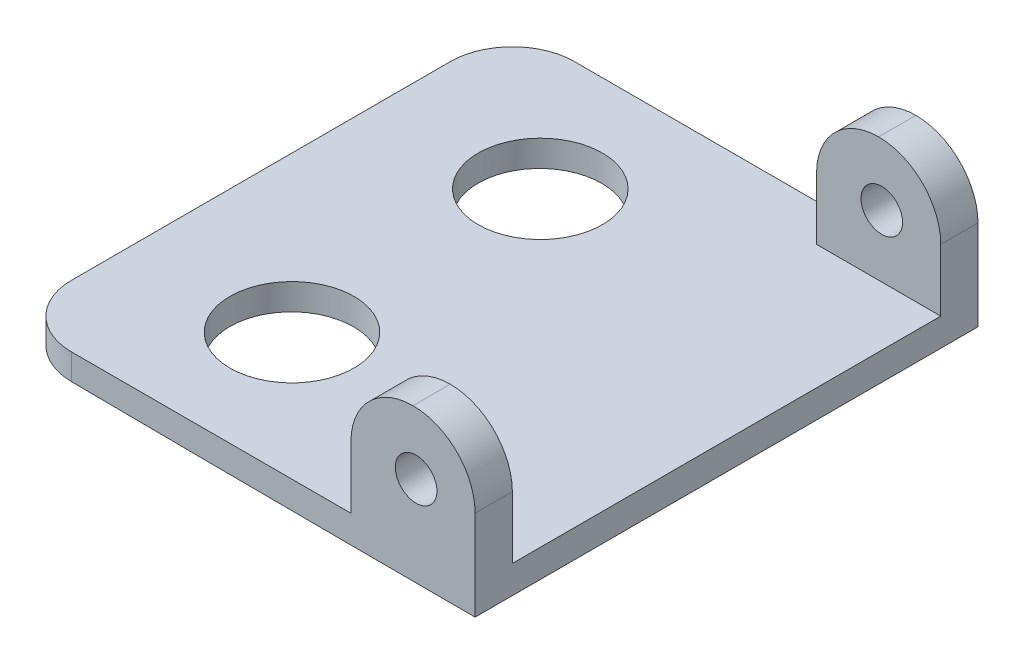
ISO-10303-21;
HEADER;
FILE_DESCRIPTION(('STEP AP214'),'2;1');
FILE_NAME('part.step','',(''),(''),'','','');
FILE_SCHEMA(('AUTOMOTIVE_DESIGN { 1 0 10303 214 1 1 1 1 }'));
ENDSEC;
DATA;
#1=APPLICATION_CONTEXT('core data for automotive mechanical design processes');
#2=APPLICATION_PROTOCOL_DEFINITION('international standard','automotive_design',2000,#1);
#3=PRODUCT_CONTEXT('',#1,'mechanical');
#4=PRODUCT('Part','Part','',(#3));
#5=PRODUCT_RELATED_PRODUCT_CATEGORY('part','',(#4));
#6=PRODUCT_DEFINITION_FORMATION('','',#4);
#7=PRODUCT_DEFINITION_CONTEXT('part definition',#1,'design');
#8=PRODUCT_DEFINITION('design','',#6,#7);
#9=PRODUCT_DEFINITION_SHAPE('','',#8);
#10=(LENGTH_UNIT() NAMED_UNIT(*) SI_UNIT(.MILLI.,.METRE.));
#11=(NAMED_UNIT(*) PLANE_ANGLE_UNIT() SI_UNIT($,.RADIAN.));
#12=(NAMED_UNIT(*) SI_UNIT($,.STERADIAN.) SOLID_ANGLE_UNIT());
#13=UNCERTAINTY_MEASURE_WITH_UNIT(LENGTH_MEASURE(1.E-05),#10,'distance_accuracy_value','');
#14=(GEOMETRIC_REPRESENTATION_CONTEXT(3) GLOBAL_UNCERTAINTY_ASSIGNED_CONTEXT((#13)) GLOBAL_UNIT_ASSIGNED_CONTEXT((#10,
#11,#12)) REPRESENTATION_CONTEXT('',''));
#15=CARTESIAN_POINT('',(0.,0.,0.));
#16=DIRECTION('',(0.,0.,1.));
#17=DIRECTION('',(1.,0.,0.));
#18=AXIS2_PLACEMENT_3D('',#15,#16,#17);
#19=CARTESIAN_POINT('',(-25.8,23.8390216957845,38.07));
#20=DIRECTION('',(0.,0.,1.));
#21=DIRECTION('',(1.,0.,0.));
#22=AXIS2_PLACEMENT_3D('',#19,#20,#21);
#23=PLANE('',#22);
#24=CARTESIAN_POINT('',(-26.75,13.8,38.07));
#25=DIRECTION('',(0.,0.,1.));
#26=DIRECTION('',(1.,0.,0.));
#27=AXIS2_PLACEMENT_3D('',#24,#25,#26);
#28=CIRCLE('',#27,0.334999999999999);
#29=CARTESIAN_POINT('',(-26.415,13.8,38.07));
#30=VERTEX_POINT('',#29);
#31=EDGE_CURVE('E344',#30,#30,#28,.T.);
#32=ORIENTED_EDGE('',*,*,#31,.T.);
#33=EDGE_LOOP('',(#32));
#34=FACE_BOUND('',#33,.T.);
#35=DIRECTION('',(0.,-1.,0.));
#36=VECTOR('',#35,1.);
#37=CARTESIAN_POINT('',(-25.8,23.8390216957845,38.07));
#38=LINE('',#37,#36);
#39=CARTESIAN_POINT('',(-25.8,13.8,38.07));
#40=VERTEX_POINT('',#39);
#41=CARTESIAN_POINT('',(-25.8,12.3504139716503,38.07));
#42=VERTEX_POINT('',#41);
#43=EDGE_CURVE('E188',#40,#42,#38,.T.);
#44=ORIENTED_EDGE('',*,*,#43,.T.);
#45=CARTESIAN_POINT('',(-25.,785.35,38.07));
#46=DIRECTION('',(0.,0.,1.));
#47=DIRECTION('',(1.,0.,0.));
#48=AXIS2_PLACEMENT_3D('',#45,#46,#47);
#49=CIRCLE('',#48,773.);
#50=CARTESIAN_POINT('',(-32.3,12.3844703675331,38.07));
#51=VERTEX_POINT('',#50);
#52=EDGE_CURVE('E165',#42,#51,#49,.F.);
#53=ORIENTED_EDGE('',*,*,#52,.T.);
#54=DIRECTION('',(0.,-1.,0.));
#55=VECTOR('',#54,1.);
#56=CARTESIAN_POINT('',(-32.3,12.8,38.07));
#57=LINE('',#56,#55);
#58=CARTESIAN_POINT('',(-32.3,12.8,38.07));
#59=VERTEX_POINT('',#58);
#60=EDGE_CURVE('E169',#51,#59,#57,.F.);
#61=ORIENTED_EDGE('',*,*,#60,.T.);
#62=DIRECTION('',(-1.,0.,0.));
#63=VECTOR('',#62,1.);
#64=CARTESIAN_POINT('',(-25.8,12.8,38.07));
#65=LINE('',#64,#63);
#66=CARTESIAN_POINT('',(-27.8,12.8,38.07));
#67=VERTEX_POINT('',#66);
#68=EDGE_CURVE('E185',#67,#59,#65,.T.);
#69=ORIENTED_EDGE('',*,*,#68,.F.);
#70=DIRECTION('',(0.,-1.,0.));
#71=VECTOR('',#70,1.);
#72=CARTESIAN_POINT('',(-27.8,14.8,38.07));
#73=LINE('',#72,#71);
#74=CARTESIAN_POINT('',(-27.8,13.8,38.07));
#75=VERTEX_POINT('',#74);
#76=EDGE_CURVE('E292',#75,#67,#73,.T.);
#77=ORIENTED_EDGE('',*,*,#76,.F.);
#78=CARTESIAN_POINT('',(-26.8,13.8,38.07));
#79=DIRECTION('',(0.,0.,1.));
#80=DIRECTION('',(1.,0.,0.));
#81=AXIS2_PLACEMENT_3D('',#78,#79,#80);
#82=CIRCLE('',#81,1.);
#83=CARTESIAN_POINT('',(-26.8,14.8,38.07));
#84=VERTEX_POINT('',#83);
#85=EDGE_CURVE('E288',#75,#84,#82,.F.);
#86=ORIENTED_EDGE('',*,*,#85,.T.);
#87=CARTESIAN_POINT('',(-26.8,13.8,38.07));
#88=DIRECTION('',(0.,0.,1.));
#89=DIRECTION('',(1.,0.,0.));
#90=AXIS2_PLACEMENT_3D('',#87,#88,#89);
#91=CIRCLE('',#90,1.);
#92=EDGE_CURVE('E341',#84,#40,#91,.F.);
#93=ORIENTED_EDGE('',*,*,#92,.T.);
#94=EDGE_LOOP('',(#44,#53,#61,#69,#77,#86,#93));
#95=FACE_BOUND('',#94,.T.);
#96=ADVANCED_FACE('F39',(#34,#95),#23,.F.);
#97=CARTESIAN_POINT('',(-25.8,23.8390216957845,46.17));
#98=DIRECTION('',(0.,0.,1.));
#99=DIRECTION('',(1.,0.,0.));
#100=AXIS2_PLACEMENT_3D('',#97,#98,#99);
#101=PLANE('',#100);
#102=CARTESIAN_POINT('',(-26.75,13.8,46.17));
#103=DIRECTION('',(0.,0.,1.));
#104=DIRECTION('',(1.,0.,0.));
#105=AXIS2_PLACEMENT_3D('',#102,#103,#104);
#106=CIRCLE('',#105,0.334999999999999);
#107=CARTESIAN_POINT('',(-26.415,13.8,46.17));
#108=VERTEX_POINT('',#107);
#109=EDGE_CURVE('E347',#108,#108,#106,.T.);
#110=ORIENTED_EDGE('',*,*,#109,.F.);
#111=EDGE_LOOP('',(#110));
#112=FACE_BOUND('',#111,.T.);
#113=CARTESIAN_POINT('',(-25.,785.35,46.17));
#114=DIRECTION('',(0.,0.,1.));
#115=DIRECTION('',(1.,0.,0.));
#116=AXIS2_PLACEMENT_3D('',#113,#114,#115);
#117=CIRCLE('',#116,773.);
#118=CARTESIAN_POINT('',(-25.8,12.3504139716503,46.17));
#119=VERTEX_POINT('',#118);
#120=CARTESIAN_POINT('',(-32.3,12.3844703675331,46.17));
#121=VERTEX_POINT('',#120);
#122=EDGE_CURVE('E61',#119,#121,#117,.F.);
#123=ORIENTED_EDGE('',*,*,#122,.F.);
#124=DIRECTION('',(0.,-1.,0.));
#125=VECTOR('',#124,1.);
#126=CARTESIAN_POINT('',(-25.8,23.8390216957845,46.17));
#127=LINE('',#126,#125);
#128=CARTESIAN_POINT('',(-25.8,13.8,46.17));
#129=VERTEX_POINT('',#128);
#130=EDGE_CURVE('E317',#129,#119,#127,.T.);
#131=ORIENTED_EDGE('',*,*,#130,.F.);
#132=CARTESIAN_POINT('',(-26.8,13.8,46.17));
#133=DIRECTION('',(0.,0.,1.));
#134=DIRECTION('',(1.,0.,0.));
#135=AXIS2_PLACEMENT_3D('',#132,#133,#134);
#136=CIRCLE('',#135,1.);
#137=CARTESIAN_POINT('',(-26.8,14.8,46.17));
#138=VERTEX_POINT('',#137);
#139=EDGE_CURVE('E336',#129,#138,#136,.T.);
#140=ORIENTED_EDGE('',*,*,#139,.T.);
#141=CARTESIAN_POINT('',(-26.8,13.8,46.17));
#142=DIRECTION('',(0.,0.,1.));
#143=DIRECTION('',(1.,0.,0.));
#144=AXIS2_PLACEMENT_3D('',#141,#142,#143);
#145=CIRCLE('',#144,1.);
#146=CARTESIAN_POINT('',(-27.8,13.8,46.17));
#147=VERTEX_POINT('',#146);
#148=EDGE_CURVE('E334',#138,#147,#145,.T.);
#149=ORIENTED_EDGE('',*,*,#148,.T.);
#150=DIRECTION('',(0.,-1.,0.));
#151=VECTOR('',#150,1.);
#152=CARTESIAN_POINT('',(-27.8,14.8,46.17));
#153=LINE('',#152,#151);
#154=CARTESIAN_POINT('',(-27.8,12.8,46.17));
#155=VERTEX_POINT('',#154);
#156=EDGE_CURVE('E360',#147,#155,#153,.T.);
#157=ORIENTED_EDGE('',*,*,#156,.T.);
#158=DIRECTION('',(-1.,0.,0.));
#159=VECTOR('',#158,1.);
#160=CARTESIAN_POINT('',(-25.8,12.8,46.17));
#161=LINE('',#160,#159);
#162=CARTESIAN_POINT('',(-32.3,12.8,46.17));
#163=VERTEX_POINT('',#162);
#164=EDGE_CURVE('E314',#155,#163,#161,.T.);
#165=ORIENTED_EDGE('',*,*,#164,.T.);
#166=DIRECTION('',(0.,-1.,0.));
#167=VECTOR('',#166,1.);
#168=CARTESIAN_POINT('',(-32.3,23.8390216957845,46.17));
#169=LINE('',#168,#167);
#170=EDGE_CURVE('E11',#163,#121,#169,.T.);
#171=ORIENTED_EDGE('',*,*,#170,.T.);
#172=EDGE_LOOP('',(#123,#131,#140,#149,#157,#165,#171));
#173=FACE_BOUND('',#172,.T.);
#174=ADVANCED_FACE('F251',(#112,#173),#101,.T.);
#175=CARTESIAN_POINT('',(-25.75,12.8,47.));
#176=DIRECTION('',(0.,1.,0.));
#177=DIRECTION('',(0.,0.,1.));
#178=AXIS2_PLACEMENT_3D('',#175,#176,#177);
#179=PLANE('',#178);
#180=CARTESIAN_POINT('',(-30.8,12.8,44.12));
#181=DIRECTION('',(0.,1.,0.));
#182=DIRECTION('',(0.,0.,1.));
#183=AXIS2_PLACEMENT_3D('',#180,#181,#182);
#184=CIRCLE('',#183,0.999999999999995);
#185=CARTESIAN_POINT('',(-30.8,12.8,45.12));
#186=VERTEX_POINT('',#185);
#187=EDGE_CURVE('E195',#186,#186,#184,.T.);
#188=ORIENTED_EDGE('',*,*,#187,.F.);
#189=EDGE_LOOP('',(#188));
#190=FACE_BOUND('',#189,.T.);
#191=CARTESIAN_POINT('',(-30.8,12.8,40.12));
#192=DIRECTION('',(0.,1.,0.));
#193=DIRECTION('',(0.,0.,1.));
#194=AXIS2_PLACEMENT_3D('',#191,#192,#193);
#195=CIRCLE('',#194,0.999999999999992);
#196=CARTESIAN_POINT('',(-30.8,12.8,41.12));
#197=VERTEX_POINT('',#196);
#198=EDGE_CURVE('E192',#197,#197,#195,.T.);
#199=ORIENTED_EDGE('',*,*,#198,.F.);
#200=EDGE_LOOP('',(#199));
#201=FACE_BOUND('',#200,.T.);
#202=ORIENTED_EDGE('',*,*,#68,.T.);
#203=CARTESIAN_POINT('',(-32.3,12.8,39.07));
#204=DIRECTION('',(0.,1.,0.));
#205=DIRECTION('',(0.,0.,1.));
#206=AXIS2_PLACEMENT_3D('',#203,#204,#205);
#207=CIRCLE('',#206,1.);
#208=CARTESIAN_POINT('',(-33.3,12.8,39.07));
#209=VERTEX_POINT('',#208);
#210=EDGE_CURVE('E54',#59,#209,#207,.T.);
#211=ORIENTED_EDGE('',*,*,#210,.T.);
#212=DIRECTION('',(0.,0.,-1.));
#213=VECTOR('',#212,1.);
#214=CARTESIAN_POINT('',(-33.3,12.8,46.17));
#215=LINE('',#214,#213);
#216=CARTESIAN_POINT('',(-33.3,12.8,45.17));
#217=VERTEX_POINT('',#216);
#218=EDGE_CURVE('E182',#217,#209,#215,.T.);
#219=ORIENTED_EDGE('',*,*,#218,.F.);
#220=CARTESIAN_POINT('',(-32.3,12.8,45.17));
#221=DIRECTION('',(0.,1.,0.));
#222=DIRECTION('',(0.,0.,1.));
#223=AXIS2_PLACEMENT_3D('',#220,#221,#222);
#224=CIRCLE('',#223,1.);
#225=EDGE_CURVE('E69',#217,#163,#224,.T.);
#226=ORIENTED_EDGE('',*,*,#225,.T.);
#227=ORIENTED_EDGE('',*,*,#164,.F.);
#228=DIRECTION('',(0.,0.,1.));
#229=VECTOR('',#228,1.);
#230=CARTESIAN_POINT('',(-27.8,12.8,46.17));
#231=LINE('',#230,#229);
#232=CARTESIAN_POINT('',(-27.8,12.8,45.57));
#233=VERTEX_POINT('',#232);
#234=EDGE_CURVE('E357',#233,#155,#231,.T.);
#235=ORIENTED_EDGE('',*,*,#234,.F.);
#236=DIRECTION('',(-1.,0.,0.));
#237=VECTOR('',#236,1.);
#238=CARTESIAN_POINT('',(-25.8,12.8,45.57));
#239=LINE('',#238,#237);
#240=CARTESIAN_POINT('',(-25.8,12.8,45.57));
#241=VERTEX_POINT('',#240);
#242=EDGE_CURVE('E312',#241,#233,#239,.T.);
#243=ORIENTED_EDGE('',*,*,#242,.F.);
#244=DIRECTION('',(0.,0.,-1.));
#245=VECTOR('',#244,1.);
#246=CARTESIAN_POINT('',(-25.8,12.8,46.17));
#247=LINE('',#246,#245);
#248=CARTESIAN_POINT('',(-25.8,12.8,38.67));
#249=VERTEX_POINT('',#248);
#250=EDGE_CURVE('E318',#241,#249,#247,.T.);
#251=ORIENTED_EDGE('',*,*,#250,.T.);
#252=DIRECTION('',(1.,0.,0.));
#253=VECTOR('',#252,1.);
#254=CARTESIAN_POINT('',(-25.8,12.8,38.67));
#255=LINE('',#254,#253);
#256=CARTESIAN_POINT('',(-27.8,12.8,38.67));
#257=VERTEX_POINT('',#256);
#258=EDGE_CURVE('E308',#257,#249,#255,.T.);
#259=ORIENTED_EDGE('',*,*,#258,.F.);
#260=DIRECTION('',(0.,0.,1.));
#261=VECTOR('',#260,1.);
#262=CARTESIAN_POINT('',(-27.8,12.8,38.07));
#263=LINE('',#262,#261);
#264=EDGE_CURVE('E311',#67,#257,#263,.T.);
#265=ORIENTED_EDGE('',*,*,#264,.F.);
#266=EDGE_LOOP('',(#202,#211,#219,#226,#227,#235,#243,#251,#259,#265));
#267=FACE_BOUND('',#266,.T.);
#268=ADVANCED_FACE('F181',(#190,#201,#267),#179,.T.);
#269=CARTESIAN_POINT('',(-33.3,23.8390216957845,46.17));
#270=DIRECTION('',(-1.,0.,0.));
#271=DIRECTION('',(0.,0.,1.));
#272=AXIS2_PLACEMENT_3D('',#269,#270,#271);
#273=PLANE('',#272);
#274=DIRECTION('',(0.,0.,1.));
#275=VECTOR('',#274,1.);
#276=CARTESIAN_POINT('',(-33.3,12.3945614396649,-25.));
#277=LINE('',#276,#275);
#278=CARTESIAN_POINT('',(-33.3,12.3945614396649,45.17));
#279=VERTEX_POINT('',#278);
#280=CARTESIAN_POINT('',(-33.3,12.3945614396649,39.07));
#281=VERTEX_POINT('',#280);
#282=EDGE_CURVE('E150',#279,#281,#277,.F.);
#283=ORIENTED_EDGE('',*,*,#282,.F.);
#284=DIRECTION('',(0.,-1.,0.));
#285=VECTOR('',#284,1.);
#286=CARTESIAN_POINT('',(-33.3,23.8390216957845,45.17));
#287=LINE('',#286,#285);
#288=EDGE_CURVE('E161',#279,#217,#287,.F.);
#289=ORIENTED_EDGE('',*,*,#288,.T.);
#290=ORIENTED_EDGE('',*,*,#218,.T.);
#291=DIRECTION('',(0.,-1.,0.));
#292=VECTOR('',#291,1.);
#293=CARTESIAN_POINT('',(-33.3,12.3501614986573,39.07));
#294=LINE('',#293,#292);
#295=EDGE_CURVE('E163',#209,#281,#294,.T.);
#296=ORIENTED_EDGE('',*,*,#295,.T.);
#297=EDGE_LOOP('',(#283,#289,#290,#296));
#298=FACE_BOUND('',#297,.T.);
#299=ADVANCED_FACE('F159',(#298),#273,.T.);
#300=CARTESIAN_POINT('',(-25.8,23.8390216957845,46.17));
#301=DIRECTION('',(-1.,0.,0.));
#302=DIRECTION('',(0.,0.,1.));
#303=AXIS2_PLACEMENT_3D('',#300,#301,#302);
#304=PLANE('',#303);
#305=ORIENTED_EDGE('',*,*,#130,.T.);
#306=DIRECTION('',(0.,0.,1.));
#307=VECTOR('',#306,1.);
#308=CARTESIAN_POINT('',(-25.8,12.3504139716503,-25.));
#309=LINE('',#308,#307);
#310=EDGE_CURVE('E376',#119,#42,#309,.F.);
#311=ORIENTED_EDGE('',*,*,#310,.T.);
#312=ORIENTED_EDGE('',*,*,#43,.F.);
#313=DIRECTION('',(0.,0.,-1.));
#314=VECTOR('',#313,1.);
#315=CARTESIAN_POINT('',(-25.8,13.8,46.17));
#316=LINE('',#315,#314);
#317=CARTESIAN_POINT('',(-25.8,13.8,38.67));
#318=VERTEX_POINT('',#317);
#319=EDGE_CURVE('E328',#40,#318,#316,.F.);
#320=ORIENTED_EDGE('',*,*,#319,.T.);
#321=DIRECTION('',(0.,-1.,0.));
#322=VECTOR('',#321,1.);
#323=CARTESIAN_POINT('',(-25.8,14.8,38.67));
#324=LINE('',#323,#322);
#325=EDGE_CURVE('E298',#318,#249,#324,.T.);
#326=ORIENTED_EDGE('',*,*,#325,.T.);
#327=ORIENTED_EDGE('',*,*,#250,.F.);
#328=DIRECTION('',(0.,-1.,0.));
#329=VECTOR('',#328,1.);
#330=CARTESIAN_POINT('',(-25.8,14.8,45.57));
#331=LINE('',#330,#329);
#332=CARTESIAN_POINT('',(-25.8,13.8,45.57));
#333=VERTEX_POINT('',#332);
#334=EDGE_CURVE('E304',#333,#241,#331,.T.);
#335=ORIENTED_EDGE('',*,*,#334,.F.);
#336=DIRECTION('',(0.,0.,-1.));
#337=VECTOR('',#336,1.);
#338=CARTESIAN_POINT('',(-25.8,13.8,46.17));
#339=LINE('',#338,#337);
#340=EDGE_CURVE('E331',#333,#129,#339,.F.);
#341=ORIENTED_EDGE('',*,*,#340,.T.);
#342=EDGE_LOOP('',(#305,#311,#312,#320,#326,#327,#335,#341));
#343=FACE_BOUND('',#342,.T.);
#344=ADVANCED_FACE('F246',(#343),#304,.F.);
#345=CARTESIAN_POINT('',(-27.8,14.8,38.07));
#346=DIRECTION('',(1.,0.,0.));
#347=DIRECTION('',(0.,0.,-1.));
#348=AXIS2_PLACEMENT_3D('',#345,#346,#347);
#349=PLANE('',#348);
#350=DIRECTION('',(0.,-1.,0.));
#351=VECTOR('',#350,1.);
#352=CARTESIAN_POINT('',(-27.8,14.8,38.67));
#353=LINE('',#352,#351);
#354=CARTESIAN_POINT('',(-27.8,13.8,38.67));
#355=VERTEX_POINT('',#354);
#356=EDGE_CURVE('E293',#355,#257,#353,.T.);
#357=ORIENTED_EDGE('',*,*,#356,.F.);
#358=DIRECTION('',(0.,0.,1.));
#359=VECTOR('',#358,1.);
#360=CARTESIAN_POINT('',(-27.8,13.8,38.07));
#361=LINE('',#360,#359);
#362=EDGE_CURVE('E167',#355,#75,#361,.F.);
#363=ORIENTED_EDGE('',*,*,#362,.T.);
#364=ORIENTED_EDGE('',*,*,#76,.T.);
#365=ORIENTED_EDGE('',*,*,#264,.T.);
#366=EDGE_LOOP('',(#357,#363,#364,#365));
#367=FACE_BOUND('',#366,.T.);
#368=ADVANCED_FACE('F243',(#367),#349,.F.);
#369=CARTESIAN_POINT('',(-25.8,14.8,38.67));
#370=DIRECTION('',(0.,0.,-1.));
#371=DIRECTION('',(-1.,0.,0.));
#372=AXIS2_PLACEMENT_3D('',#369,#370,#371);
#373=PLANE('',#372);
#374=CARTESIAN_POINT('',(-26.75,13.8,38.67));
#375=DIRECTION('',(0.,0.,-1.));
#376=DIRECTION('',(-1.,0.,0.));
#377=AXIS2_PLACEMENT_3D('',#374,#375,#376);
#378=CIRCLE('',#377,0.334999999999999);
#379=CARTESIAN_POINT('',(-27.085,13.8,38.67));
#380=VERTEX_POINT('',#379);
#381=EDGE_CURVE('E351',#380,#380,#378,.T.);
#382=ORIENTED_EDGE('',*,*,#381,.T.);
#383=EDGE_LOOP('',(#382));
#384=FACE_BOUND('',#383,.T.);
#385=ORIENTED_EDGE('',*,*,#325,.F.);
#386=CARTESIAN_POINT('',(-26.8,13.8,38.67));
#387=DIRECTION('',(0.,0.,-1.));
#388=DIRECTION('',(-1.,0.,0.));
#389=AXIS2_PLACEMENT_3D('',#386,#387,#388);
#390=CIRCLE('',#389,1.);
#391=CARTESIAN_POINT('',(-26.8,14.8,38.67));
#392=VERTEX_POINT('',#391);
#393=EDGE_CURVE('E171',#318,#392,#390,.F.);
#394=ORIENTED_EDGE('',*,*,#393,.T.);
#395=CARTESIAN_POINT('',(-26.8,13.8,38.67));
#396=DIRECTION('',(0.,0.,-1.));
#397=DIRECTION('',(-1.,0.,0.));
#398=AXIS2_PLACEMENT_3D('',#395,#396,#397);
#399=CIRCLE('',#398,1.);
#400=EDGE_CURVE('E286',#392,#355,#399,.F.);
#401=ORIENTED_EDGE('',*,*,#400,.T.);
#402=ORIENTED_EDGE('',*,*,#356,.T.);
#403=ORIENTED_EDGE('',*,*,#258,.T.);
#404=EDGE_LOOP('',(#385,#394,#401,#402,#403));
#405=FACE_BOUND('',#404,.T.);
#406=ADVANCED_FACE('F241',(#384,#405),#373,.F.);
#407=CARTESIAN_POINT('',(-25.8,14.8,45.57));
#408=DIRECTION('',(0.,0.,1.));
#409=DIRECTION('',(1.,0.,0.));
#410=AXIS2_PLACEMENT_3D('',#407,#408,#409);
#411=PLANE('',#410);
#412=CARTESIAN_POINT('',(-26.75,13.8,45.57));
#413=DIRECTION('',(0.,0.,1.));
#414=DIRECTION('',(1.,0.,0.));
#415=AXIS2_PLACEMENT_3D('',#412,#413,#414);
#416=CIRCLE('',#415,0.334999999999999);
#417=CARTESIAN_POINT('',(-26.415,13.8,45.57));
#418=VERTEX_POINT('',#417);
#419=EDGE_CURVE('E174',#418,#418,#416,.T.);
#420=ORIENTED_EDGE('',*,*,#419,.T.);
#421=EDGE_LOOP('',(#420));
#422=FACE_BOUND('',#421,.T.);
#423=CARTESIAN_POINT('',(-26.8,13.8,45.57));
#424=DIRECTION('',(0.,0.,1.));
#425=DIRECTION('',(1.,0.,0.));
#426=AXIS2_PLACEMENT_3D('',#423,#424,#425);
#427=CIRCLE('',#426,1.);
#428=CARTESIAN_POINT('',(-27.8,13.8,45.57));
#429=VERTEX_POINT('',#428);
#430=CARTESIAN_POINT('',(-26.8,14.8,45.57));
#431=VERTEX_POINT('',#430);
#432=EDGE_CURVE('E316',#429,#431,#427,.F.);
#433=ORIENTED_EDGE('',*,*,#432,.T.);
#434=CARTESIAN_POINT('',(-26.8,13.8,45.57));
#435=DIRECTION('',(0.,0.,1.));
#436=DIRECTION('',(1.,0.,0.));
#437=AXIS2_PLACEMENT_3D('',#434,#435,#436);
#438=CIRCLE('',#437,1.);
#439=EDGE_CURVE('E326',#431,#333,#438,.F.);
#440=ORIENTED_EDGE('',*,*,#439,.T.);
#441=ORIENTED_EDGE('',*,*,#334,.T.);
#442=ORIENTED_EDGE('',*,*,#242,.T.);
#443=DIRECTION('',(0.,-1.,0.));
#444=VECTOR('',#443,1.);
#445=CARTESIAN_POINT('',(-27.8,14.8,45.57));
#446=LINE('',#445,#444);
#447=EDGE_CURVE('E361',#429,#233,#446,.T.);
#448=ORIENTED_EDGE('',*,*,#447,.F.);
#449=EDGE_LOOP('',(#433,#440,#441,#442,#448));
#450=FACE_BOUND('',#449,.T.);
#451=ADVANCED_FACE('F237',(#422,#450),#411,.F.);
#452=CARTESIAN_POINT('',(-27.8,14.8,46.17));
#453=DIRECTION('',(1.,0.,0.));
#454=DIRECTION('',(0.,0.,-1.));
#455=AXIS2_PLACEMENT_3D('',#452,#453,#454);
#456=PLANE('',#455);
#457=ORIENTED_EDGE('',*,*,#156,.F.);
#458=DIRECTION('',(0.,0.,1.));
#459=VECTOR('',#458,1.);
#460=CARTESIAN_POINT('',(-27.8,13.8,45.57));
#461=LINE('',#460,#459);
#462=EDGE_CURVE('E338',#147,#429,#461,.F.);
#463=ORIENTED_EDGE('',*,*,#462,.T.);
#464=ORIENTED_EDGE('',*,*,#447,.T.);
#465=ORIENTED_EDGE('',*,*,#234,.T.);
#466=EDGE_LOOP('',(#457,#463,#464,#465));
#467=FACE_BOUND('',#466,.T.);
#468=ADVANCED_FACE('F233',(#467),#456,.F.);
#469=CARTESIAN_POINT('',(-26.8,13.8,0.));
#470=DIRECTION('',(0.,0.,-1.));
#471=DIRECTION('',(-1.,0.,0.));
#472=AXIS2_PLACEMENT_3D('',#469,#470,#471);
#473=CYLINDRICAL_SURFACE('',#472,1.);
#474=ORIENTED_EDGE('',*,*,#462,.F.);
#475=ORIENTED_EDGE('',*,*,#148,.F.);
#476=DIRECTION('',(0.,0.,1.));
#477=VECTOR('',#476,1.);
#478=CARTESIAN_POINT('',(-26.8,14.8,46.17));
#479=LINE('',#478,#477);
#480=EDGE_CURVE('E296',#431,#138,#479,.T.);
#481=ORIENTED_EDGE('',*,*,#480,.F.);
#482=ORIENTED_EDGE('',*,*,#432,.F.);
#483=EDGE_LOOP('',(#474,#475,#481,#482));
#484=FACE_BOUND('',#483,.T.);
#485=ADVANCED_FACE('F236',(#484),#473,.T.);
#486=CARTESIAN_POINT('',(-26.8,13.8,0.));
#487=DIRECTION('',(0.,0.,1.));
#488=DIRECTION('',(1.,0.,0.));
#489=AXIS2_PLACEMENT_3D('',#486,#487,#488);
#490=CYLINDRICAL_SURFACE('',#489,1.);
#491=ORIENTED_EDGE('',*,*,#139,.F.);
#492=ORIENTED_EDGE('',*,*,#340,.F.);
#493=ORIENTED_EDGE('',*,*,#439,.F.);
#494=ORIENTED_EDGE('',*,*,#480,.T.);
#495=EDGE_LOOP('',(#491,#492,#493,#494));
#496=FACE_BOUND('',#495,.T.);
#497=ADVANCED_FACE('F266',(#496),#490,.T.);
#498=CARTESIAN_POINT('',(-26.8,13.8,0.));
#499=DIRECTION('',(0.,0.,1.));
#500=DIRECTION('',(1.,0.,0.));
#501=AXIS2_PLACEMENT_3D('',#498,#499,#500);
#502=CYLINDRICAL_SURFACE('',#501,1.);
#503=ORIENTED_EDGE('',*,*,#362,.F.);
#504=ORIENTED_EDGE('',*,*,#400,.F.);
#505=DIRECTION('',(0.,0.,1.));
#506=VECTOR('',#505,1.);
#507=CARTESIAN_POINT('',(-26.8,14.8,0.));
#508=LINE('',#507,#506);
#509=EDGE_CURVE('E301',#84,#392,#508,.T.);
#510=ORIENTED_EDGE('',*,*,#509,.F.);
#511=ORIENTED_EDGE('',*,*,#85,.F.);
#512=EDGE_LOOP('',(#503,#504,#510,#511));
#513=FACE_BOUND('',#512,.T.);
#514=ADVANCED_FACE('F269',(#513),#502,.T.);
#515=CARTESIAN_POINT('',(-26.8,13.8,0.));
#516=DIRECTION('',(0.,0.,-1.));
#517=DIRECTION('',(-1.,0.,0.));
#518=AXIS2_PLACEMENT_3D('',#515,#516,#517);
#519=CYLINDRICAL_SURFACE('',#518,1.);
#520=ORIENTED_EDGE('',*,*,#393,.F.);
#521=ORIENTED_EDGE('',*,*,#319,.F.);
#522=ORIENTED_EDGE('',*,*,#92,.F.);
#523=ORIENTED_EDGE('',*,*,#509,.T.);
#524=EDGE_LOOP('',(#520,#521,#522,#523));
#525=FACE_BOUND('',#524,.T.);
#526=ADVANCED_FACE('F274',(#525),#519,.T.);
#527=CARTESIAN_POINT('',(-26.75,13.8,37.27));
#528=DIRECTION('',(0.,0.,1.));
#529=DIRECTION('',(1.,0.,0.));
#530=AXIS2_PLACEMENT_3D('',#527,#528,#529);
#531=CYLINDRICAL_SURFACE('',#530,0.334999999999999);
#532=ORIENTED_EDGE('',*,*,#109,.T.);
#533=EDGE_LOOP('',(#532));
#534=FACE_BOUND('',#533,.T.);
#535=ORIENTED_EDGE('',*,*,#419,.F.);
#536=EDGE_LOOP('',(#535));
#537=FACE_BOUND('',#536,.T.);
#538=ADVANCED_FACE('F231',(#534,#537),#531,.F.);
#539=ORIENTED_EDGE('',*,*,#381,.F.);
#540=EDGE_LOOP('',(#539));
#541=FACE_BOUND('',#540,.T.);
#542=ORIENTED_EDGE('',*,*,#31,.F.);
#543=EDGE_LOOP('',(#542));
#544=FACE_BOUND('',#543,.T.);
#545=ADVANCED_FACE('F228',(#541,#544),#531,.F.);
#546=CARTESIAN_POINT('',(-32.3,23.8390216957845,39.07));
#547=DIRECTION('',(0.,1.,0.));
#548=DIRECTION('',(0.,0.,1.));
#549=AXIS2_PLACEMENT_3D('',#546,#547,#548);
#550=CYLINDRICAL_SURFACE('',#549,1.);
#551=CARTESIAN_POINT('',(-33.3,12.3945614396649,39.07));
#552=CARTESIAN_POINT('',(-33.2999998137601,12.3945614465502,39.0418663857055));
#553=CARTESIAN_POINT('',(-33.2988120047079,12.3945486819936,39.0137462500586));
#554=CARTESIAN_POINT('',(-33.2940733568954,12.3944978166805,38.9577072120704));
#555=CARTESIAN_POINT('',(-33.2905226317855,12.3944597171425,38.929788300116));
#556=CARTESIAN_POINT('',(-33.2763598368352,12.3943078914775,38.8466822855112));
#557=CARTESIAN_POINT('',(-33.2622370536639,12.3941566368247,38.7920518781899));
#558=CARTESIAN_POINT('',(-33.2250213255105,12.3937597338588,38.6859391980101));
#559=CARTESIAN_POINT('',(-33.2019240800075,12.3935140402917,38.6344584481629));
#560=CARTESIAN_POINT('',(-33.1474176281085,12.3929375923448,38.5361068768723));
#561=CARTESIAN_POINT('',(-33.1160098818989,12.3926068529083,38.4892352475714));
#562=CARTESIAN_POINT('',(-33.0457726824167,12.3918725624951,38.4014308411662));
#563=CARTESIAN_POINT('',(-33.0069430987487,12.3914690102393,38.3604981684264));
#564=CARTESIAN_POINT('',(-32.9229544547583,12.3906035550816,38.2857239039598));
#565=CARTESIAN_POINT('',(-32.8777941568232,12.3901416407721,38.2518837019993));
#566=CARTESIAN_POINT('',(-32.7824268359952,12.3891755690483,38.192259155652));
#567=CARTESIAN_POINT('',(-32.7322185614688,12.3886714011624,38.1664768157355));
#568=CARTESIAN_POINT('',(-32.6281962367001,12.3876378374712,38.1237206706646));
#569=CARTESIAN_POINT('',(-32.5743843173477,12.3871084566272,38.106741710972));
#570=CARTESIAN_POINT('',(-32.4835361453191,12.3862246599377,38.0862921914962));
#571=CARTESIAN_POINT('',(-32.4470712611249,12.3858724608665,38.0801863176623));
#572=CARTESIAN_POINT('',(-32.3737426877949,12.3851694450506,38.0720407582208));
#573=CARTESIAN_POINT('',(-32.3368796386332,12.3848186270531,38.069995309781));
#574=CARTESIAN_POINT('',(-32.3,12.3844703675331,38.07));
#575=B_SPLINE_CURVE_WITH_KNOTS('',3,(#551,#552,#553,#554,#555,#556,#557,#558,#559,#560,#561,
#562,#563,#564,#565,#566,#567,#568,#569,#570,#571,#572,#573,#574),.UNSPECIFIED.,.F.,.F.,(4,2,2,
2,2,2,2,2,2,2,2,4),(0.,0.0843490000436562,0.168693943402284,0.337105342710309,0.505597543708924,
0.674060159624869,0.842525735554249,1.01102429143565,1.1795647296424,1.34800637261645,
1.4587185361077,1.5692734566973),.UNSPECIFIED.);
#576=EDGE_CURVE('E164',#281,#51,#575,.T.);
#577=ORIENTED_EDGE('',*,*,#576,.F.);
#578=ORIENTED_EDGE('',*,*,#295,.F.);
#579=ORIENTED_EDGE('',*,*,#210,.F.);
#580=ORIENTED_EDGE('',*,*,#60,.F.);
#581=EDGE_LOOP('',(#577,#578,#579,#580));
#582=FACE_BOUND('',#581,.T.);
#583=ADVANCED_FACE('F190',(#582),#550,.T.);
#584=CARTESIAN_POINT('',(-32.3,23.8390216957845,45.17));
#585=DIRECTION('',(0.,-1.,0.));
#586=DIRECTION('',(0.,0.,-1.));
#587=AXIS2_PLACEMENT_3D('',#584,#585,#586);
#588=CYLINDRICAL_SURFACE('',#587,1.);
#589=CARTESIAN_POINT('',(-32.3,12.3844703675331,46.17));
#590=CARTESIAN_POINT('',(-32.3281358734896,12.384736078247,46.1699998122093));
#591=CARTESIAN_POINT('',(-32.3562582527438,12.3850032170464,46.1688118140744));
#592=CARTESIAN_POINT('',(-32.412301746432,12.3855386136776,46.1640724090051));
#593=CARTESIAN_POINT('',(-32.4402228704481,12.385806871455,46.1605211153547));
#594=CARTESIAN_POINT('',(-32.5233356078748,12.3866098730834,46.1463560161709));
#595=CARTESIAN_POINT('',(-32.5779704607007,12.3871437323793,46.1322308988931));
#596=CARTESIAN_POINT('',(-32.6840917610926,12.3881913965449,46.0950087836693));
#597=CARTESIAN_POINT('',(-32.7355766829383,12.3887051916534,46.0719074771635));
#598=CARTESIAN_POINT('',(-32.8339359317319,12.3896958011523,46.0173910367494));
#599=CARTESIAN_POINT('',(-32.8808110701048,12.3901726220478,45.9859773696082));
#600=CARTESIAN_POINT('',(-32.9686194957405,12.3910728663387,45.915727871816));
#601=CARTESIAN_POINT('',(-33.0095529297253,12.3914962910526,45.8768922244951));
#602=CARTESIAN_POINT('',(-33.084327551315,12.3922747330483,45.7928901292063));
#603=CARTESIAN_POINT('',(-33.118167350817,12.3926297369402,45.7477224450475));
#604=CARTESIAN_POINT('',(-33.1777863614246,12.3932581945368,45.6523440653232));
#605=CARTESIAN_POINT('',(-33.2035643679654,12.3935316360543,45.6021326176158));
#606=CARTESIAN_POINT('',(-33.2463113375642,12.3939864978724,45.4981041078244));
#607=CARTESIAN_POINT('',(-33.2632854676314,12.3941679721471,45.4442891816175));
#608=CARTESIAN_POINT('',(-33.28372252678,12.3943867811849,45.3534538712961));
#609=CARTESIAN_POINT('',(-33.2898228895041,12.3944522063874,45.3170051064181));
#610=CARTESIAN_POINT('',(-33.2979610872476,12.3945395454511,45.2437093237239));
#611=CARTESIAN_POINT('',(-33.3000046806552,12.3945615209869,45.2068629451579));
#612=CARTESIAN_POINT('',(-33.3,12.3945614396648,45.17));
#613=B_SPLINE_CURVE_WITH_KNOTS('',3,(#589,#590,#591,#592,#593,#594,#595,#596,#597,#598,#599,
#600,#601,#602,#603,#604,#605,#606,#607,#608,#609,#610,#611,#612),.UNSPECIFIED.,.F.,.F.,(4,2,2,
2,2,2,2,2,2,2,2,4),(0.,0.0843595364693325,0.168715029474684,0.337147965382873,0.505661848966982,
0.674146017044173,0.842626023937432,1.01113896877184,1.17967708020051,1.34811616409156,
1.45877331937247,1.56927328952342),.UNSPECIFIED.);
#614=EDGE_CURVE('E146',#121,#279,#613,.T.);
#615=ORIENTED_EDGE('',*,*,#614,.F.);
#616=ORIENTED_EDGE('',*,*,#170,.F.);
#617=ORIENTED_EDGE('',*,*,#225,.F.);
#618=ORIENTED_EDGE('',*,*,#288,.F.);
#619=EDGE_LOOP('',(#615,#616,#617,#618));
#620=FACE_BOUND('',#619,.T.);
#621=ADVANCED_FACE('F41',(#620),#588,.T.);
#622=CARTESIAN_POINT('',(-30.8,12.3501614986573,40.12));
#623=DIRECTION('',(0.,1.,0.));
#624=DIRECTION('',(0.,0.,1.));
#625=AXIS2_PLACEMENT_3D('',#622,#623,#624);
#626=CYLINDRICAL_SURFACE('',#625,0.999999999999992);
#627=CARTESIAN_POINT('',(-30.8,12.3717596853065,41.12));
#628=CARTESIAN_POINT('',(-30.8561719303637,12.3721811770665,41.1199975092358));
#629=CARTESIAN_POINT('',(-30.9123845451654,12.3726091456735,41.1152511922538));
#630=CARTESIAN_POINT('',(-31.0232615748024,12.3734651658146,41.0963830778203));
#631=CARTESIAN_POINT('',(-31.0779240433064,12.3738932168277,41.0822499946548));
#632=CARTESIAN_POINT('',(-31.1840784321427,12.3747352014875,41.0450106456884));
#633=CARTESIAN_POINT('',(-31.2355718523268,12.3751491417705,41.0219086631314));
#634=CARTESIAN_POINT('',(-31.3339348836513,12.3759488888233,40.9673931086707));
#635=CARTESIAN_POINT('',(-31.3808056408231,12.3763347025598,40.9359816039759));
#636=CARTESIAN_POINT('',(-31.4686138028725,12.3770645314369,40.8657325355871));
#637=CARTESIAN_POINT('',(-31.509550637202,12.3774085425577,40.8268942586388));
#638=CARTESIAN_POINT('',(-31.5843243333088,12.3780418573407,40.7428942856382));
#639=CARTESIAN_POINT('',(-31.6181609172413,12.378331158862,40.6977323422455));
#640=CARTESIAN_POINT('',(-31.6777700257155,12.3788438245205,40.6023705946103));
#641=CARTESIAN_POINT('',(-31.7035429421067,12.3790671918617,40.5521710353247));
#642=CARTESIAN_POINT('',(-31.7462950883885,12.379439136092,40.4481573548683));
#643=CARTESIAN_POINT('',(-31.7632743377954,12.3795877131471,40.3943432417199));
#644=CARTESIAN_POINT('',(-31.7879567098916,12.3798040689652,40.2846298765294));
#645=CARTESIAN_POINT('',(-31.7956601353023,12.3798718503649,40.2287306925961));
#646=CARTESIAN_POINT('',(-31.8015731268226,12.3799238572374,40.116432498026));
#647=CARTESIAN_POINT('',(-31.7997827113571,12.3799080828722,40.0600334883594));
#648=CARTESIAN_POINT('',(-31.7867590237421,12.3797936249589,39.9483376388501));
#649=CARTESIAN_POINT('',(-31.7755259258097,12.3796949429403,39.893040778692));
#650=CARTESIAN_POINT('',(-31.7439360290815,12.3794186877087,39.7851177812865));
#651=CARTESIAN_POINT('',(-31.7235792205182,12.3792411144112,39.7324916468984));
#652=CARTESIAN_POINT('',(-31.674319655016,12.3788142105239,39.6314035458137));
#653=CARTESIAN_POINT('',(-31.6454168260295,12.3785648793293,39.5829416142282));
#654=CARTESIAN_POINT('',(-31.5798858482119,12.3780042768451,39.4915579708839));
#655=CARTESIAN_POINT('',(-31.5432577013116,12.3776930055711,39.4486362577405));
#656=CARTESIAN_POINT('',(-31.4633146291724,12.3770204217726,39.3695500135594));
#657=CARTESIAN_POINT('',(-31.419999497417,12.3766591077028,39.3333856912889));
#658=CARTESIAN_POINT('',(-31.3279128656884,12.3758997642412,39.26884228348));
#659=CARTESIAN_POINT('',(-31.2791413639379,12.3755017348374,39.2404632004773));
#660=CARTESIAN_POINT('',(-31.1775246644429,12.3746829504943,39.1922948910273));
#661=CARTESIAN_POINT('',(-31.1246793283167,12.374262194783,39.172505956525));
#662=CARTESIAN_POINT('',(-31.0164164910697,12.3734119580372,39.1420810191494));
#663=CARTESIAN_POINT('',(-30.9609989897392,12.3729824770018,39.1314450170222));
#664=CARTESIAN_POINT('',(-30.8491638151868,12.3721281246946,39.1196277355837));
#665=CARTESIAN_POINT('',(-30.7927461228994,12.3717032535109,39.1184466366946));
#666=CARTESIAN_POINT('',(-30.6805131257643,12.3708703203237,39.1255732076048));
#667=CARTESIAN_POINT('',(-30.6246978209498,12.3704622583213,39.1338808779286));
#668=CARTESIAN_POINT('',(-30.5152542037826,12.3696736220159,39.1597492033632));
#669=CARTESIAN_POINT('',(-30.4616258861172,12.3692930476462,39.1773098359948));
#670=CARTESIAN_POINT('',(-30.3580785466682,12.3685683486983,39.2211856628472));
#671=CARTESIAN_POINT('',(-30.3081595240921,12.3682242241123,39.2475008551973));
#672=CARTESIAN_POINT('',(-30.2134488358863,12.3675796324198,39.3081382954795));
#673=CARTESIAN_POINT('',(-30.1686570758165,12.367279164509,39.3424603958954));
#674=CARTESIAN_POINT('',(-30.0854714767965,12.3667274036728,39.4181376820063));
#675=CARTESIAN_POINT('',(-30.0470776396703,12.3664761107613,39.4594928697065));
#676=CARTESIAN_POINT('',(-29.9777787454028,12.3660267359323,39.5480613536539));
#677=CARTESIAN_POINT('',(-29.9468735174884,12.3658286528012,39.5952745162765));
#678=CARTESIAN_POINT('',(-29.8934281610344,12.3654884616497,39.6942193988456));
#679=CARTESIAN_POINT('',(-29.8708880227676,12.3653463535641,39.7459511135378));
#680=CARTESIAN_POINT('',(-29.8348130929206,12.3651198697017,39.8524635555076));
#681=CARTESIAN_POINT('',(-29.8212781271914,12.3650354928085,39.9072442238));
#682=CARTESIAN_POINT('',(-29.8035970960118,12.3649254129848,40.0183005073887));
#683=CARTESIAN_POINT('',(-29.7994510468277,12.3648997101559,40.0745761252749));
#684=CARTESIAN_POINT('',(-29.8006655978196,12.3649072523427,40.1870239900835));
#685=CARTESIAN_POINT('',(-29.8060260826795,12.3649404966433,40.2431962382516));
#686=CARTESIAN_POINT('',(-29.8261013208522,12.3650655766678,40.3538435971576));
#687=CARTESIAN_POINT('',(-29.8408160927893,12.3651574125085,40.4083187045163));
#688=CARTESIAN_POINT('',(-29.8791824877168,12.3653986373223,40.5140262688677));
#689=CARTESIAN_POINT('',(-29.9028342766491,12.365548027364,40.5652586656293));
#690=CARTESIAN_POINT('',(-29.9584022363479,12.365902481916,40.6630234480783));
#691=CARTESIAN_POINT('',(-29.9903180828707,12.3661075442419,40.7095560180657));
#692=CARTESIAN_POINT('',(-30.061504661608,12.3665704015324,40.7965984691443));
#693=CARTESIAN_POINT('',(-30.1007746984609,12.3668281915116,40.8371089189966));
#694=CARTESIAN_POINT('',(-30.1855696177304,12.3673923940129,40.9109722274721));
#695=CARTESIAN_POINT('',(-30.2310960528493,12.3676988186079,40.9443233040134));
#696=CARTESIAN_POINT('',(-30.3271202432055,12.3683546196862,41.0029220551535));
#697=CARTESIAN_POINT('',(-30.3776204549741,12.3687040174153,41.0281656990281));
#698=CARTESIAN_POINT('',(-30.4821022954553,12.3694379725587,41.069787369954));
#699=CARTESIAN_POINT('',(-30.5360796638537,12.3698224871795,41.0861760235738));
#700=CARTESIAN_POINT('',(-30.6253341571377,12.370468058084,41.1052548130538));
#701=CARTESIAN_POINT('',(-30.6600314046474,12.3707213244804,41.1107773613165));
#702=CARTESIAN_POINT('',(-30.7298138059188,12.3712354459888,41.1181507330292));
#703=CARTESIAN_POINT('',(-30.7648989596843,12.3714963011008,41.1200015564431));
#704=CARTESIAN_POINT('',(-30.8,12.3717596853065,41.12));
#705=B_SPLINE_CURVE_WITH_KNOTS('',3,(#627,#628,#629,#630,#631,#632,#633,#634,#635,#636,#637,
#638,#639,#640,#641,#642,#643,#644,#645,#646,#647,#648,#649,#650,#651,#652,#653,#654,#655,#656,
#657,#658,#659,#660,#661,#662,#663,#664,#665,#666,#667,#668,#669,#670,#671,#672,#673,#674,#675,
#676,#677,#678,#679,#680,#681,#682,#683,#684,#685,#686,#687,#688,#689,#690,#691,#692,#693,#694,
#695,#696,#697,#698,#699,#700,#701,#702,#703,#704),.UNSPECIFIED.,.T.,.F.,(4,2,2,2,2,2,2,2,2,2,2,
2,2,2,2,2,2,2,2,2,2,2,2,2,2,2,2,2,2,2,2,2,2,2,2,2,2,2,4),(0.,0.168392413377329,
0.336987652431066,0.505502474931838,0.673975414364887,0.842464541781513,1.01096026123402,
1.17944779145493,1.34793494774021,1.51641660521108,1.684897935707,1.85337615779971,
2.02185456025896,2.19033438312681,2.35881416388878,2.52729914891241,2.6957841888125,
2.8642749544027,3.03276573372869,3.20125972825462,3.36975373209413,3.53824732659348,
3.70674088509044,3.87523133957049,4.04372184208709,4.21220850191983,4.38069496583018,
4.54917817132569,4.71766166872039,4.88614312239224,5.05462491151142,5.22310982914444,
5.39158813720441,5.56005052314904,5.7285547935607,5.89714270902442,6.06552785603554,
6.17075387896912,6.27597990293786),.UNSPECIFIED.);
#706=CARTESIAN_POINT('',(-30.8,12.3717596853065,41.12));
#707=VERTEX_POINT('',#706);
#708=EDGE_CURVE('E155',#707,#707,#705,.T.);
#709=ORIENTED_EDGE('',*,*,#708,.T.);
#710=EDGE_LOOP('',(#709));
#711=FACE_BOUND('',#710,.T.);
#712=ORIENTED_EDGE('',*,*,#198,.T.);
#713=EDGE_LOOP('',(#712));
#714=FACE_BOUND('',#713,.T.);
#715=ADVANCED_FACE('F223',(#711,#714),#626,.F.);
#716=CARTESIAN_POINT('',(-30.8,12.3501614986573,44.12));
#717=DIRECTION('',(0.,1.,0.));
#718=DIRECTION('',(0.,0.,1.));
#719=AXIS2_PLACEMENT_3D('',#716,#717,#718);
#720=CYLINDRICAL_SURFACE('',#719,0.999999999999995);
#721=CARTESIAN_POINT('',(-30.8,12.3717596853065,45.12));
#722=CARTESIAN_POINT('',(-30.8561719303637,12.3721811770665,45.1199975092358));
#723=CARTESIAN_POINT('',(-30.9123845451654,12.3726091456735,45.1152511922538));
#724=CARTESIAN_POINT('',(-31.0232615748024,12.3734651658146,45.0963830778203));
#725=CARTESIAN_POINT('',(-31.0779240433064,12.3738932168277,45.0822499946548));
#726=CARTESIAN_POINT('',(-31.1840784321427,12.3747352014875,45.0450106456884));
#727=CARTESIAN_POINT('',(-31.2355718523268,12.3751491417705,45.0219086631315));
#728=CARTESIAN_POINT('',(-31.3339348836513,12.3759488888233,44.9673931086707));
#729=CARTESIAN_POINT('',(-31.3808056408231,12.3763347025598,44.9359816039759));
#730=CARTESIAN_POINT('',(-31.4686138028725,12.3770645314369,44.8657325355871));
#731=CARTESIAN_POINT('',(-31.509550637202,12.3774085425577,44.8268942586388));
#732=CARTESIAN_POINT('',(-31.5843243333088,12.3780418573407,44.7428942856382));
#733=CARTESIAN_POINT('',(-31.6181609172413,12.378331158862,44.6977323422456));
#734=CARTESIAN_POINT('',(-31.6777700257155,12.3788438245205,44.6023705946103));
#735=CARTESIAN_POINT('',(-31.7035429421067,12.3790671918617,44.5521710353247));
#736=CARTESIAN_POINT('',(-31.7462950883885,12.379439136092,44.4481573548683));
#737=CARTESIAN_POINT('',(-31.7632743377954,12.3795877131471,44.3943432417199));
#738=CARTESIAN_POINT('',(-31.7879567098916,12.3798040689652,44.2846298765294));
#739=CARTESIAN_POINT('',(-31.7956601353023,12.3798718503649,44.2287306925961));
#740=CARTESIAN_POINT('',(-31.8015731268226,12.3799238572374,44.116432498026));
#741=CARTESIAN_POINT('',(-31.7997827113571,12.3799080828722,44.0600334883594));
#742=CARTESIAN_POINT('',(-31.7867590237421,12.3797936249589,43.9483376388501));
#743=CARTESIAN_POINT('',(-31.7755259258097,12.3796949429403,43.893040778692));
#744=CARTESIAN_POINT('',(-31.7439360290815,12.3794186877087,43.7851177812865));
#745=CARTESIAN_POINT('',(-31.7235792205182,12.3792411144112,43.7324916468984));
#746=CARTESIAN_POINT('',(-31.674319655016,12.3788142105239,43.6314035458137));
#747=CARTESIAN_POINT('',(-31.6454168260295,12.3785648793293,43.5829416142282));
#748=CARTESIAN_POINT('',(-31.5798858482119,12.3780042768451,43.4915579708839));
#749=CARTESIAN_POINT('',(-31.5432577013116,12.3776930055711,43.4486362577405));
#750=CARTESIAN_POINT('',(-31.4633146291724,12.3770204217726,43.3695500135594));
#751=CARTESIAN_POINT('',(-31.419999497417,12.3766591077028,43.3333856912889));
#752=CARTESIAN_POINT('',(-31.3279128656884,12.3758997642412,43.26884228348));
#753=CARTESIAN_POINT('',(-31.2791413639379,12.3755017348374,43.2404632004773));
#754=CARTESIAN_POINT('',(-31.1775246644429,12.3746829504943,43.1922948910273));
#755=CARTESIAN_POINT('',(-31.1246793283167,12.374262194783,43.172505956525));
#756=CARTESIAN_POINT('',(-31.0164164910697,12.3734119580372,43.1420810191494));
#757=CARTESIAN_POINT('',(-30.9609989897392,12.3729824770018,43.1314450170222));
#758=CARTESIAN_POINT('',(-30.8491638151868,12.3721281246946,43.1196277355837));
#759=CARTESIAN_POINT('',(-30.7927461228994,12.3717032535109,43.1184466366946));
#760=CARTESIAN_POINT('',(-30.6805131257643,12.3708703203237,43.1255732076048));
#761=CARTESIAN_POINT('',(-30.6246978209498,12.3704622583213,43.1338808779286));
#762=CARTESIAN_POINT('',(-30.5152542037826,12.3696736220159,43.1597492033632));
#763=CARTESIAN_POINT('',(-30.4616258861172,12.3692930476462,43.1773098359948));
#764=CARTESIAN_POINT('',(-30.3580785466682,12.3685683486983,43.2211856628472));
#765=CARTESIAN_POINT('',(-30.3081595240921,12.3682242241123,43.2475008551973));
#766=CARTESIAN_POINT('',(-30.2134488358863,12.3675796324198,43.3081382954795));
#767=CARTESIAN_POINT('',(-30.1686570758165,12.367279164509,43.3424603958954));
#768=CARTESIAN_POINT('',(-30.0854714767965,12.3667274036728,43.4181376820063));
#769=CARTESIAN_POINT('',(-30.0470776396703,12.3664761107613,43.4594928697065));
#770=CARTESIAN_POINT('',(-29.9777787454028,12.3660267359323,43.5480613536539));
#771=CARTESIAN_POINT('',(-29.9468735174884,12.3658286528012,43.5952745162765));
#772=CARTESIAN_POINT('',(-29.8934281610344,12.3654884616497,43.6942193988456));
#773=CARTESIAN_POINT('',(-29.8708880227676,12.3653463535641,43.7459511135378));
#774=CARTESIAN_POINT('',(-29.8348130929206,12.3651198697017,43.8524635555076));
#775=CARTESIAN_POINT('',(-29.8212781271914,12.3650354928085,43.9072442238));
#776=CARTESIAN_POINT('',(-29.8035970960117,12.3649254129848,44.0183005073887));
#777=CARTESIAN_POINT('',(-29.7994510468277,12.3648997101559,44.0745761252749));
#778=CARTESIAN_POINT('',(-29.8006655978196,12.3649072523427,44.1870239900835));
#779=CARTESIAN_POINT('',(-29.8060260826795,12.3649404966432,44.2431962382516));
#780=CARTESIAN_POINT('',(-29.8261013208522,12.3650655766678,44.3538435971576));
#781=CARTESIAN_POINT('',(-29.8408160927893,12.3651574125085,44.4083187045163));
#782=CARTESIAN_POINT('',(-29.8791824877168,12.3653986373223,44.5140262688677));
#783=CARTESIAN_POINT('',(-29.9028342766491,12.365548027364,44.5652586656293));
#784=CARTESIAN_POINT('',(-29.9584022363479,12.365902481916,44.6630234480783));
#785=CARTESIAN_POINT('',(-29.9903180828707,12.3661075442419,44.7095560180657));
#786=CARTESIAN_POINT('',(-30.061504661608,12.3665704015324,44.7965984691443));
#787=CARTESIAN_POINT('',(-30.1007746984609,12.3668281915116,44.8371089189966));
#788=CARTESIAN_POINT('',(-30.1855696177304,12.3673923940129,44.9109722274721));
#789=CARTESIAN_POINT('',(-30.2310960528493,12.3676988186079,44.9443233040134));
#790=CARTESIAN_POINT('',(-30.3271202432055,12.3683546196862,45.0029220551535));
#791=CARTESIAN_POINT('',(-30.3776204549741,12.3687040174153,45.0281656990281));
#792=CARTESIAN_POINT('',(-30.4821022954552,12.3694379725587,45.069787369954));
#793=CARTESIAN_POINT('',(-30.5360796638537,12.3698224871795,45.0861760235738));
#794=CARTESIAN_POINT('',(-30.6253341571377,12.370468058084,45.1052548130538));
#795=CARTESIAN_POINT('',(-30.6600314046474,12.3707213244804,45.1107773613165));
#796=CARTESIAN_POINT('',(-30.7298138059188,12.3712354459888,45.1181507330292));
#797=CARTESIAN_POINT('',(-30.7648989596843,12.3714963011008,45.1200015564431));
#798=CARTESIAN_POINT('',(-30.8,12.3717596853065,45.12));
#799=B_SPLINE_CURVE_WITH_KNOTS('',3,(#721,#722,#723,#724,#725,#726,#727,#728,#729,#730,#731,
#732,#733,#734,#735,#736,#737,#738,#739,#740,#741,#742,#743,#744,#745,#746,#747,#748,#749,#750,
#751,#752,#753,#754,#755,#756,#757,#758,#759,#760,#761,#762,#763,#764,#765,#766,#767,#768,#769,
#770,#771,#772,#773,#774,#775,#776,#777,#778,#779,#780,#781,#782,#783,#784,#785,#786,#787,#788,
#789,#790,#791,#792,#793,#794,#795,#796,#797,#798),.UNSPECIFIED.,.T.,.F.,(4,2,2,2,2,2,2,2,2,2,2,
2,2,2,2,2,2,2,2,2,2,2,2,2,2,2,2,2,2,2,2,2,2,2,2,2,2,2,4),(0.,0.168392413377328,
0.336987652431065,0.505502474931843,0.673975414364893,0.842464541781518,1.01096026123403,
1.17944779145493,1.34793494774021,1.51641660521108,1.684897935707,1.85337615779972,
2.02185456025897,2.19033438312681,2.35881416388879,2.52729914891241,2.6957841888125,
2.86427495440271,3.0327657337287,3.20125972825462,3.36975373209413,3.53824732659349,
3.70674088509045,3.8752313395705,4.0437218420871,4.21220850191983,4.38069496583019,
4.54917817132572,4.7176616687204,4.88614312239225,5.05462491151143,5.22310982914444,
5.39158813720442,5.56005052314905,5.72855479356072,5.89714270902444,6.06552785603555,
6.17075387896914,6.27597990293788),.UNSPECIFIED.);
#800=CARTESIAN_POINT('',(-30.8,12.3717596853065,45.12));
#801=VERTEX_POINT('',#800);
#802=EDGE_CURVE('E44',#801,#801,#799,.T.);
#803=ORIENTED_EDGE('',*,*,#802,.T.);
#804=EDGE_LOOP('',(#803));
#805=FACE_BOUND('',#804,.T.);
#806=ORIENTED_EDGE('',*,*,#187,.T.);
#807=EDGE_LOOP('',(#806));
#808=FACE_BOUND('',#807,.T.);
#809=ADVANCED_FACE('F207',(#805,#808),#720,.F.);
#810=CARTESIAN_POINT('',(-25.,785.35,-25.));
#811=DIRECTION('',(0.,0.,1.));
#812=DIRECTION('',(1.,0.,0.));
#813=AXIS2_PLACEMENT_3D('',#810,#811,#812);
#814=CYLINDRICAL_SURFACE('',#813,773.);
#815=ORIENTED_EDGE('',*,*,#576,.T.);
#816=ORIENTED_EDGE('',*,*,#52,.F.);
#817=ORIENTED_EDGE('',*,*,#310,.F.);
#818=ORIENTED_EDGE('',*,*,#122,.T.);
#819=ORIENTED_EDGE('',*,*,#614,.T.);
#820=ORIENTED_EDGE('',*,*,#282,.T.);
#821=EDGE_LOOP('',(#815,#816,#817,#818,#819,#820));
#822=FACE_BOUND('',#821,.T.);
#823=ORIENTED_EDGE('',*,*,#802,.F.);
#824=EDGE_LOOP('',(#823));
#825=FACE_BOUND('',#824,.T.);
#826=ORIENTED_EDGE('',*,*,#708,.F.);
#827=EDGE_LOOP('',(#826));
#828=FACE_BOUND('',#827,.T.);
#829=ADVANCED_FACE('F148',(#822,#825,#828),#814,.T.);
#830=CLOSED_SHELL('',(#96,#174,#268,#299,#344,#368,#406,#451,#468,#485,#497,#514,#526,#538,#545,
#583,#621,#715,#809,#829));
#831=MANIFOLD_SOLID_BREP('B2',#830);
#832=ADVANCED_BREP_SHAPE_REPRESENTATION('',(#18,#831),#14);
#833=SHAPE_DEFINITION_REPRESENTATION(#9,#832);
ENDSEC;
END-ISO-10303-21;
